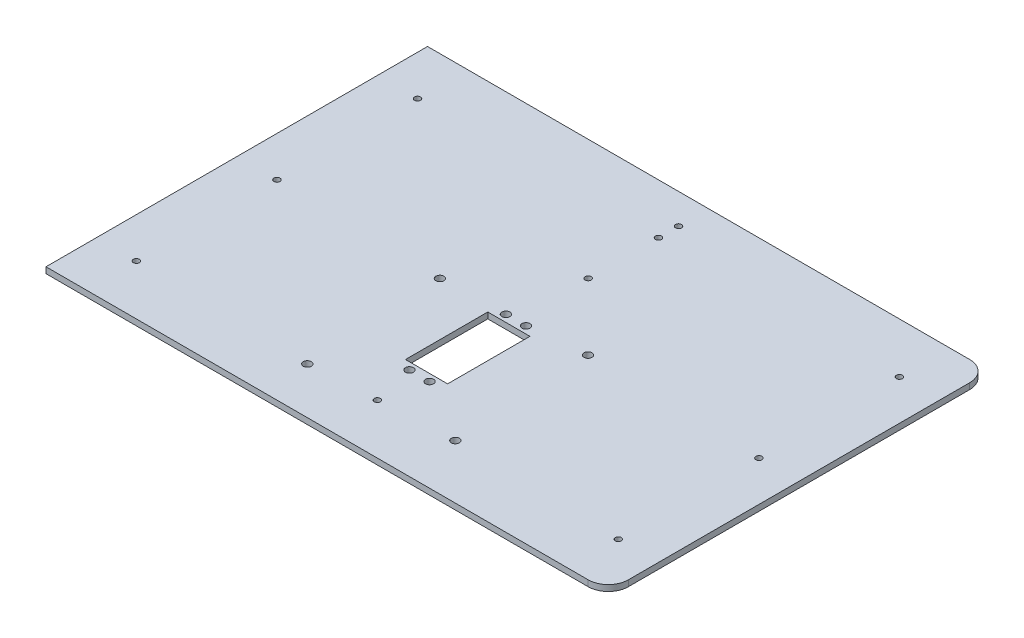
ISO-10303-21;
HEADER;
FILE_DESCRIPTION(('STEP AP214'),'2;1');
FILE_NAME('part.step','',(''),(''),'','','');
FILE_SCHEMA(('AUTOMOTIVE_DESIGN { 1 0 10303 214 1 1 1 1 }'));
ENDSEC;
DATA;
#1=APPLICATION_CONTEXT('core data for automotive mechanical design processes');
#2=APPLICATION_PROTOCOL_DEFINITION('international standard','automotive_design',2000,#1);
#3=PRODUCT_CONTEXT('',#1,'mechanical');
#4=PRODUCT('Part','Part','',(#3));
#5=PRODUCT_RELATED_PRODUCT_CATEGORY('part','',(#4));
#6=PRODUCT_DEFINITION_FORMATION('','',#4);
#7=PRODUCT_DEFINITION_CONTEXT('part definition',#1,'design');
#8=PRODUCT_DEFINITION('design','',#6,#7);
#9=PRODUCT_DEFINITION_SHAPE('','',#8);
#10=(LENGTH_UNIT() NAMED_UNIT(*) SI_UNIT(.MILLI.,.METRE.));
#11=(NAMED_UNIT(*) PLANE_ANGLE_UNIT() SI_UNIT($,.RADIAN.));
#12=(NAMED_UNIT(*) SI_UNIT($,.STERADIAN.) SOLID_ANGLE_UNIT());
#13=UNCERTAINTY_MEASURE_WITH_UNIT(LENGTH_MEASURE(1.E-05),#10,'distance_accuracy_value','');
#14=(GEOMETRIC_REPRESENTATION_CONTEXT(3) GLOBAL_UNCERTAINTY_ASSIGNED_CONTEXT((#13)) GLOBAL_UNIT_ASSIGNED_CONTEXT((#10,
#11,#12)) REPRESENTATION_CONTEXT('',''));
#15=CARTESIAN_POINT('',(0.,0.,0.));
#16=DIRECTION('',(0.,0.,1.));
#17=DIRECTION('',(1.,0.,0.));
#18=AXIS2_PLACEMENT_3D('',#15,#16,#17);
#19=CARTESIAN_POINT('',(0.,3.,0.));
#20=DIRECTION('',(0.,-1.,0.));
#21=DIRECTION('',(0.,0.,-1.));
#22=AXIS2_PLACEMENT_3D('',#19,#20,#21);
#23=PLANE('',#22);
#24=CARTESIAN_POINT('',(0.,3.,-35.));
#25=DIRECTION('',(0.,1.,0.));
#26=DIRECTION('',(0.,0.,1.));
#27=AXIS2_PLACEMENT_3D('',#24,#25,#26);
#28=CIRCLE('',#27,1.5);
#29=CARTESIAN_POINT('',(0.,3.,-33.5));
#30=VERTEX_POINT('',#29);
#31=EDGE_CURVE('E282',#30,#30,#28,.T.);
#32=ORIENTED_EDGE('',*,*,#31,.F.);
#33=EDGE_LOOP('',(#32));
#34=FACE_BOUND('',#33,.T.);
#35=CARTESIAN_POINT('',(0.,3.,-80.));
#36=DIRECTION('',(0.,1.,0.));
#37=DIRECTION('',(0.,0.,1.));
#38=AXIS2_PLACEMENT_3D('',#35,#36,#37);
#39=CIRCLE('',#38,1.5);
#40=CARTESIAN_POINT('',(0.,3.,-78.5));
#41=VERTEX_POINT('',#40);
#42=EDGE_CURVE('E272',#41,#41,#39,.T.);
#43=ORIENTED_EDGE('',*,*,#42,.F.);
#44=EDGE_LOOP('',(#43));
#45=FACE_BOUND('',#44,.T.);
#46=CARTESIAN_POINT('',(-120.,3.,0.));
#47=DIRECTION('',(0.,1.,0.));
#48=DIRECTION('',(0.,0.,1.));
#49=AXIS2_PLACEMENT_3D('',#46,#47,#48);
#50=CIRCLE('',#49,1.5);
#51=CARTESIAN_POINT('',(-120.,3.,1.5));
#52=VERTEX_POINT('',#51);
#53=EDGE_CURVE('E269',#52,#52,#50,.T.);
#54=ORIENTED_EDGE('',*,*,#53,.F.);
#55=EDGE_LOOP('',(#54));
#56=FACE_BOUND('',#55,.T.);
#57=CARTESIAN_POINT('',(120.,3.,0.));
#58=DIRECTION('',(0.,1.,0.));
#59=DIRECTION('',(0.,0.,1.));
#60=AXIS2_PLACEMENT_3D('',#57,#58,#59);
#61=CIRCLE('',#60,1.5);
#62=CARTESIAN_POINT('',(120.,3.,1.5));
#63=VERTEX_POINT('',#62);
#64=EDGE_CURVE('E266',#63,#63,#61,.T.);
#65=ORIENTED_EDGE('',*,*,#64,.F.);
#66=EDGE_LOOP('',(#65));
#67=FACE_BOUND('',#66,.T.);
#68=CARTESIAN_POINT('',(0.,3.,-70.));
#69=DIRECTION('',(0.,-1.,0.));
#70=DIRECTION('',(0.,0.,-1.));
#71=AXIS2_PLACEMENT_3D('',#68,#69,#70);
#72=CIRCLE('',#71,1.5);
#73=CARTESIAN_POINT('',(0.,3.,-71.5));
#74=VERTEX_POINT('',#73);
#75=EDGE_CURVE('E259',#74,#74,#72,.T.);
#76=ORIENTED_EDGE('',*,*,#75,.T.);
#77=EDGE_LOOP('',(#76));
#78=FACE_BOUND('',#77,.T.);
#79=CARTESIAN_POINT('',(-120.,3.,-70.));
#80=DIRECTION('',(0.,-1.,0.));
#81=DIRECTION('',(0.,0.,-1.));
#82=AXIS2_PLACEMENT_3D('',#79,#80,#81);
#83=CIRCLE('',#82,1.5);
#84=CARTESIAN_POINT('',(-120.,3.,-71.5));
#85=VERTEX_POINT('',#84);
#86=EDGE_CURVE('E265',#85,#85,#83,.T.);
#87=ORIENTED_EDGE('',*,*,#86,.T.);
#88=EDGE_LOOP('',(#87));
#89=FACE_BOUND('',#88,.T.);
#90=CARTESIAN_POINT('',(120.,3.,-70.));
#91=DIRECTION('',(0.,-1.,0.));
#92=DIRECTION('',(0.,0.,-1.));
#93=AXIS2_PLACEMENT_3D('',#90,#91,#92);
#94=CIRCLE('',#93,1.5);
#95=CARTESIAN_POINT('',(120.,3.,-71.5));
#96=VERTEX_POINT('',#95);
#97=EDGE_CURVE('E254',#96,#96,#94,.T.);
#98=ORIENTED_EDGE('',*,*,#97,.T.);
#99=EDGE_LOOP('',(#98));
#100=FACE_BOUND('',#99,.T.);
#101=CARTESIAN_POINT('',(0.,3.,70.));
#102=DIRECTION('',(0.,1.,0.));
#103=DIRECTION('',(0.,0.,1.));
#104=AXIS2_PLACEMENT_3D('',#101,#102,#103);
#105=CIRCLE('',#104,1.5);
#106=CARTESIAN_POINT('',(0.,3.,71.5));
#107=VERTEX_POINT('',#106);
#108=EDGE_CURVE('E247',#107,#107,#105,.T.);
#109=ORIENTED_EDGE('',*,*,#108,.F.);
#110=EDGE_LOOP('',(#109));
#111=FACE_BOUND('',#110,.T.);
#112=CARTESIAN_POINT('',(-120.,3.,70.));
#113=DIRECTION('',(0.,1.,0.));
#114=DIRECTION('',(0.,0.,1.));
#115=AXIS2_PLACEMENT_3D('',#112,#113,#114);
#116=CIRCLE('',#115,1.5);
#117=CARTESIAN_POINT('',(-120.,3.,71.5));
#118=VERTEX_POINT('',#117);
#119=EDGE_CURVE('E253',#118,#118,#116,.T.);
#120=ORIENTED_EDGE('',*,*,#119,.F.);
#121=EDGE_LOOP('',(#120));
#122=FACE_BOUND('',#121,.T.);
#123=CARTESIAN_POINT('',(120.,3.,70.));
#124=DIRECTION('',(0.,1.,0.));
#125=DIRECTION('',(0.,0.,1.));
#126=AXIS2_PLACEMENT_3D('',#123,#124,#125);
#127=CIRCLE('',#126,1.5);
#128=CARTESIAN_POINT('',(120.,3.,71.5));
#129=VERTEX_POINT('',#128);
#130=EDGE_CURVE('E242',#129,#129,#127,.T.);
#131=ORIENTED_EDGE('',*,*,#130,.F.);
#132=EDGE_LOOP('',(#131));
#133=FACE_BOUND('',#132,.T.);
#134=CARTESIAN_POINT('',(33.0281343560983,3.,-1.86993817402548));
#135=DIRECTION('',(0.,1.,0.));
#136=DIRECTION('',(0.,0.,1.));
#137=AXIS2_PLACEMENT_3D('',#134,#135,#136);
#138=CIRCLE('',#137,2.);
#139=CARTESIAN_POINT('',(33.0281343560983,3.,0.130061825974525));
#140=VERTEX_POINT('',#139);
#141=EDGE_CURVE('E162',#140,#140,#138,.T.);
#142=ORIENTED_EDGE('',*,*,#141,.F.);
#143=EDGE_LOOP('',(#142));
#144=FACE_BOUND('',#143,.T.);
#145=CARTESIAN_POINT('',(-36.8699381740117,3.,1.97186564390339));
#146=DIRECTION('',(0.,1.,0.));
#147=DIRECTION('',(0.,0.,1.));
#148=AXIS2_PLACEMENT_3D('',#145,#146,#147);
#149=CIRCLE('',#148,2.);
#150=CARTESIAN_POINT('',(-36.8699381740117,3.,3.97186564390339));
#151=VERTEX_POINT('',#150);
#152=EDGE_CURVE('E168',#151,#151,#149,.T.);
#153=ORIENTED_EDGE('',*,*,#152,.F.);
#154=EDGE_LOOP('',(#153));
#155=FACE_BOUND('',#154,.T.);
#156=CARTESIAN_POINT('',(-33.028134356083,3.,71.8699381740136));
#157=DIRECTION('',(0.,1.,0.));
#158=DIRECTION('',(0.,0.,1.));
#159=AXIS2_PLACEMENT_3D('',#156,#157,#158);
#160=CIRCLE('',#159,2.);
#161=CARTESIAN_POINT('',(-33.028134356083,3.,73.8699381740136));
#162=VERTEX_POINT('',#161);
#163=EDGE_CURVE('E174',#162,#162,#160,.T.);
#164=ORIENTED_EDGE('',*,*,#163,.F.);
#165=EDGE_LOOP('',(#164));
#166=FACE_BOUND('',#165,.T.);
#167=CARTESIAN_POINT('',(5.,3.,49.));
#168=DIRECTION('',(0.,1.,0.));
#169=DIRECTION('',(0.,0.,1.));
#170=AXIS2_PLACEMENT_3D('',#167,#168,#169);
#171=CIRCLE('',#170,2.);
#172=CARTESIAN_POINT('',(5.,3.,51.));
#173=VERTEX_POINT('',#172);
#174=EDGE_CURVE('E180',#173,#173,#171,.T.);
#175=ORIENTED_EDGE('',*,*,#174,.F.);
#176=EDGE_LOOP('',(#175));
#177=FACE_BOUND('',#176,.T.);
#178=CARTESIAN_POINT('',(-5.,3.,49.));
#179=DIRECTION('',(0.,1.,0.));
#180=DIRECTION('',(0.,0.,1.));
#181=AXIS2_PLACEMENT_3D('',#178,#179,#180);
#182=CIRCLE('',#181,2.);
#183=CARTESIAN_POINT('',(-5.,3.,51.));
#184=VERTEX_POINT('',#183);
#185=EDGE_CURVE('E186',#184,#184,#182,.T.);
#186=ORIENTED_EDGE('',*,*,#185,.F.);
#187=EDGE_LOOP('',(#186));
#188=FACE_BOUND('',#187,.T.);
#189=CARTESIAN_POINT('',(-5.,3.,1.));
#190=DIRECTION('',(0.,1.,0.));
#191=DIRECTION('',(0.,0.,1.));
#192=AXIS2_PLACEMENT_3D('',#189,#190,#191);
#193=CIRCLE('',#192,2.);
#194=CARTESIAN_POINT('',(-5.,3.,3.));
#195=VERTEX_POINT('',#194);
#196=EDGE_CURVE('E192',#195,#195,#193,.T.);
#197=ORIENTED_EDGE('',*,*,#196,.F.);
#198=EDGE_LOOP('',(#197));
#199=FACE_BOUND('',#198,.T.);
#200=CARTESIAN_POINT('',(5.,3.,1.));
#201=DIRECTION('',(0.,1.,0.));
#202=DIRECTION('',(0.,0.,1.));
#203=AXIS2_PLACEMENT_3D('',#200,#201,#202);
#204=CIRCLE('',#203,2.);
#205=CARTESIAN_POINT('',(5.,3.,3.));
#206=VERTEX_POINT('',#205);
#207=EDGE_CURVE('E198',#206,#206,#204,.T.);
#208=ORIENTED_EDGE('',*,*,#207,.F.);
#209=EDGE_LOOP('',(#208));
#210=FACE_BOUND('',#209,.T.);
#211=DIRECTION('',(1.,0.,0.));
#212=VECTOR('',#211,1.);
#213=CARTESIAN_POINT('',(140.,3.,95.));
#214=LINE('',#213,#212);
#215=CARTESIAN_POINT('',(-140.,3.,95.));
#216=VERTEX_POINT('',#215);
#217=CARTESIAN_POINT('',(130.,3.,95.));
#218=VERTEX_POINT('',#217);
#219=EDGE_CURVE('E211',#216,#218,#214,.T.);
#220=ORIENTED_EDGE('',*,*,#219,.T.);
#221=CARTESIAN_POINT('',(130.,3.,85.));
#222=DIRECTION('',(0.,-1.,0.));
#223=DIRECTION('',(0.,0.,-1.));
#224=AXIS2_PLACEMENT_3D('',#221,#222,#223);
#225=CIRCLE('',#224,10.);
#226=CARTESIAN_POINT('',(140.,3.,84.9999999999999));
#227=VERTEX_POINT('',#226);
#228=EDGE_CURVE('E44',#218,#227,#225,.F.);
#229=ORIENTED_EDGE('',*,*,#228,.T.);
#230=DIRECTION('',(0.,0.,-1.));
#231=VECTOR('',#230,1.);
#232=CARTESIAN_POINT('',(140.,3.,-95.));
#233=LINE('',#232,#231);
#234=CARTESIAN_POINT('',(140.,3.,-85.));
#235=VERTEX_POINT('',#234);
#236=EDGE_CURVE('E204',#227,#235,#233,.T.);
#237=ORIENTED_EDGE('',*,*,#236,.T.);
#238=CARTESIAN_POINT('',(130.,3.,-85.));
#239=DIRECTION('',(0.,-1.,0.));
#240=DIRECTION('',(0.,0.,-1.));
#241=AXIS2_PLACEMENT_3D('',#238,#239,#240);
#242=CIRCLE('',#241,10.);
#243=CARTESIAN_POINT('',(130.,3.,-95.));
#244=VERTEX_POINT('',#243);
#245=EDGE_CURVE('E52',#235,#244,#242,.F.);
#246=ORIENTED_EDGE('',*,*,#245,.T.);
#247=DIRECTION('',(-1.,0.,0.));
#248=VECTOR('',#247,1.);
#249=CARTESIAN_POINT('',(140.,3.,-95.));
#250=LINE('',#249,#248);
#251=CARTESIAN_POINT('',(-140.,3.,-95.));
#252=VERTEX_POINT('',#251);
#253=EDGE_CURVE('E206',#244,#252,#250,.T.);
#254=ORIENTED_EDGE('',*,*,#253,.T.);
#255=DIRECTION('',(0.,0.,1.));
#256=VECTOR('',#255,1.);
#257=CARTESIAN_POINT('',(-140.,3.,-95.));
#258=LINE('',#257,#256);
#259=EDGE_CURVE('E209',#252,#216,#258,.T.);
#260=ORIENTED_EDGE('',*,*,#259,.T.);
#261=EDGE_LOOP('',(#220,#229,#237,#246,#254,#260));
#262=FACE_BOUND('',#261,.T.);
#263=DIRECTION('',(0.,0.,-1.));
#264=VECTOR('',#263,1.);
#265=CARTESIAN_POINT('',(10.5,3.,45.5));
#266=LINE('',#265,#264);
#267=CARTESIAN_POINT('',(10.5,3.,45.5));
#268=VERTEX_POINT('',#267);
#269=CARTESIAN_POINT('',(10.5,3.,4.5));
#270=VERTEX_POINT('',#269);
#271=EDGE_CURVE('E118',#268,#270,#266,.T.);
#272=ORIENTED_EDGE('',*,*,#271,.F.);
#273=DIRECTION('',(1.,0.,0.));
#274=VECTOR('',#273,1.);
#275=CARTESIAN_POINT('',(10.5,3.,45.5));
#276=LINE('',#275,#274);
#277=CARTESIAN_POINT('',(-10.5,3.,45.5));
#278=VERTEX_POINT('',#277);
#279=EDGE_CURVE('E144',#278,#268,#276,.T.);
#280=ORIENTED_EDGE('',*,*,#279,.F.);
#281=DIRECTION('',(0.,0.,1.));
#282=VECTOR('',#281,1.);
#283=CARTESIAN_POINT('',(-10.5,3.,45.5));
#284=LINE('',#283,#282);
#285=CARTESIAN_POINT('',(-10.5,3.,4.5));
#286=VERTEX_POINT('',#285);
#287=EDGE_CURVE('E142',#286,#278,#284,.T.);
#288=ORIENTED_EDGE('',*,*,#287,.F.);
#289=DIRECTION('',(-1.,0.,0.));
#290=VECTOR('',#289,1.);
#291=CARTESIAN_POINT('',(10.5,3.,4.5));
#292=LINE('',#291,#290);
#293=EDGE_CURVE('E128',#270,#286,#292,.T.);
#294=ORIENTED_EDGE('',*,*,#293,.F.);
#295=EDGE_LOOP('',(#272,#280,#288,#294));
#296=FACE_BOUND('',#295,.T.);
#297=CARTESIAN_POINT('',(36.8699381740273,3.,68.0281343560848));
#298=DIRECTION('',(0.,1.,0.));
#299=DIRECTION('',(0.,0.,1.));
#300=AXIS2_PLACEMENT_3D('',#297,#298,#299);
#301=CIRCLE('',#300,2.);
#302=CARTESIAN_POINT('',(36.8699381740273,3.,70.0281343560848));
#303=VERTEX_POINT('',#302);
#304=EDGE_CURVE('E151',#303,#303,#301,.T.);
#305=ORIENTED_EDGE('',*,*,#304,.F.);
#306=EDGE_LOOP('',(#305));
#307=FACE_BOUND('',#306,.T.);
#308=ADVANCED_FACE('F35',(#34,#45,#56,#67,#78,#89,#100,#111,#122,#133,#144,#155,#166,#177,#188,
#199,#210,#262,#296,#307),#23,.F.);
#309=CARTESIAN_POINT('',(0.,0.,0.));
#310=DIRECTION('',(0.,-1.,0.));
#311=DIRECTION('',(0.,0.,-1.));
#312=AXIS2_PLACEMENT_3D('',#309,#310,#311);
#313=PLANE('',#312);
#314=CARTESIAN_POINT('',(0.,0.,-35.));
#315=DIRECTION('',(0.,-1.,0.));
#316=DIRECTION('',(0.,0.,-1.));
#317=AXIS2_PLACEMENT_3D('',#314,#315,#316);
#318=CIRCLE('',#317,1.5);
#319=CARTESIAN_POINT('',(0.,0.,-36.5));
#320=VERTEX_POINT('',#319);
#321=EDGE_CURVE('E39',#320,#320,#318,.T.);
#322=ORIENTED_EDGE('',*,*,#321,.F.);
#323=EDGE_LOOP('',(#322));
#324=FACE_BOUND('',#323,.T.);
#325=CARTESIAN_POINT('',(0.,0.,-80.));
#326=DIRECTION('',(0.,-1.,0.));
#327=DIRECTION('',(0.,0.,-1.));
#328=AXIS2_PLACEMENT_3D('',#325,#326,#327);
#329=CIRCLE('',#328,1.5);
#330=CARTESIAN_POINT('',(0.,0.,-81.5));
#331=VERTEX_POINT('',#330);
#332=EDGE_CURVE('E270',#331,#331,#329,.T.);
#333=ORIENTED_EDGE('',*,*,#332,.F.);
#334=EDGE_LOOP('',(#333));
#335=FACE_BOUND('',#334,.T.);
#336=CARTESIAN_POINT('',(-120.,0.,0.));
#337=DIRECTION('',(0.,-1.,0.));
#338=DIRECTION('',(0.,0.,-1.));
#339=AXIS2_PLACEMENT_3D('',#336,#337,#338);
#340=CIRCLE('',#339,1.5);
#341=CARTESIAN_POINT('',(-120.,0.,-1.5));
#342=VERTEX_POINT('',#341);
#343=EDGE_CURVE('E267',#342,#342,#340,.T.);
#344=ORIENTED_EDGE('',*,*,#343,.F.);
#345=EDGE_LOOP('',(#344));
#346=FACE_BOUND('',#345,.T.);
#347=CARTESIAN_POINT('',(120.,0.,0.));
#348=DIRECTION('',(0.,-1.,0.));
#349=DIRECTION('',(0.,0.,-1.));
#350=AXIS2_PLACEMENT_3D('',#347,#348,#349);
#351=CIRCLE('',#350,1.5);
#352=CARTESIAN_POINT('',(120.,0.,-1.5));
#353=VERTEX_POINT('',#352);
#354=EDGE_CURVE('E262',#353,#353,#351,.T.);
#355=ORIENTED_EDGE('',*,*,#354,.F.);
#356=EDGE_LOOP('',(#355));
#357=FACE_BOUND('',#356,.T.);
#358=CARTESIAN_POINT('',(0.,0.,-70.));
#359=DIRECTION('',(0.,-1.,0.));
#360=DIRECTION('',(0.,0.,-1.));
#361=AXIS2_PLACEMENT_3D('',#358,#359,#360);
#362=CIRCLE('',#361,1.5);
#363=CARTESIAN_POINT('',(0.,0.,-71.5));
#364=VERTEX_POINT('',#363);
#365=EDGE_CURVE('E258',#364,#364,#362,.F.);
#366=ORIENTED_EDGE('',*,*,#365,.T.);
#367=EDGE_LOOP('',(#366));
#368=FACE_BOUND('',#367,.T.);
#369=CARTESIAN_POINT('',(-120.,0.,-70.));
#370=DIRECTION('',(0.,-1.,0.));
#371=DIRECTION('',(0.,0.,-1.));
#372=AXIS2_PLACEMENT_3D('',#369,#370,#371);
#373=CIRCLE('',#372,1.5);
#374=CARTESIAN_POINT('',(-120.,0.,-71.5));
#375=VERTEX_POINT('',#374);
#376=EDGE_CURVE('E255',#375,#375,#373,.F.);
#377=ORIENTED_EDGE('',*,*,#376,.T.);
#378=EDGE_LOOP('',(#377));
#379=FACE_BOUND('',#378,.T.);
#380=CARTESIAN_POINT('',(120.,0.,-70.));
#381=DIRECTION('',(0.,-1.,0.));
#382=DIRECTION('',(0.,0.,-1.));
#383=AXIS2_PLACEMENT_3D('',#380,#381,#382);
#384=CIRCLE('',#383,1.5);
#385=CARTESIAN_POINT('',(120.,0.,-71.5));
#386=VERTEX_POINT('',#385);
#387=EDGE_CURVE('E250',#386,#386,#384,.F.);
#388=ORIENTED_EDGE('',*,*,#387,.T.);
#389=EDGE_LOOP('',(#388));
#390=FACE_BOUND('',#389,.T.);
#391=CARTESIAN_POINT('',(0.,0.,70.));
#392=DIRECTION('',(0.,-1.,0.));
#393=DIRECTION('',(0.,0.,-1.));
#394=AXIS2_PLACEMENT_3D('',#391,#392,#393);
#395=CIRCLE('',#394,1.5);
#396=CARTESIAN_POINT('',(0.,0.,68.5));
#397=VERTEX_POINT('',#396);
#398=EDGE_CURVE('E246',#397,#397,#395,.T.);
#399=ORIENTED_EDGE('',*,*,#398,.F.);
#400=EDGE_LOOP('',(#399));
#401=FACE_BOUND('',#400,.T.);
#402=CARTESIAN_POINT('',(-120.,0.,70.));
#403=DIRECTION('',(0.,-1.,0.));
#404=DIRECTION('',(0.,0.,-1.));
#405=AXIS2_PLACEMENT_3D('',#402,#403,#404);
#406=CIRCLE('',#405,1.5);
#407=CARTESIAN_POINT('',(-120.,0.,68.5));
#408=VERTEX_POINT('',#407);
#409=EDGE_CURVE('E243',#408,#408,#406,.T.);
#410=ORIENTED_EDGE('',*,*,#409,.F.);
#411=EDGE_LOOP('',(#410));
#412=FACE_BOUND('',#411,.T.);
#413=CARTESIAN_POINT('',(120.,0.,70.));
#414=DIRECTION('',(0.,-1.,0.));
#415=DIRECTION('',(0.,0.,-1.));
#416=AXIS2_PLACEMENT_3D('',#413,#414,#415);
#417=CIRCLE('',#416,1.5);
#418=CARTESIAN_POINT('',(120.,0.,68.5));
#419=VERTEX_POINT('',#418);
#420=EDGE_CURVE('E238',#419,#419,#417,.T.);
#421=ORIENTED_EDGE('',*,*,#420,.F.);
#422=EDGE_LOOP('',(#421));
#423=FACE_BOUND('',#422,.T.);
#424=DIRECTION('',(1.,0.,0.));
#425=VECTOR('',#424,1.);
#426=CARTESIAN_POINT('',(10.5,0.,45.5));
#427=LINE('',#426,#425);
#428=CARTESIAN_POINT('',(-10.5,0.,45.5));
#429=VERTEX_POINT('',#428);
#430=CARTESIAN_POINT('',(10.5,0.,45.5));
#431=VERTEX_POINT('',#430);
#432=EDGE_CURVE('E129',#429,#431,#427,.T.);
#433=ORIENTED_EDGE('',*,*,#432,.T.);
#434=DIRECTION('',(0.,0.,-1.));
#435=VECTOR('',#434,1.);
#436=CARTESIAN_POINT('',(10.5,0.,45.5));
#437=LINE('',#436,#435);
#438=CARTESIAN_POINT('',(10.5,0.,4.5));
#439=VERTEX_POINT('',#438);
#440=EDGE_CURVE('E149',#431,#439,#437,.T.);
#441=ORIENTED_EDGE('',*,*,#440,.T.);
#442=DIRECTION('',(-1.,0.,0.));
#443=VECTOR('',#442,1.);
#444=CARTESIAN_POINT('',(10.5,0.,4.5));
#445=LINE('',#444,#443);
#446=CARTESIAN_POINT('',(-10.5,0.,4.5));
#447=VERTEX_POINT('',#446);
#448=EDGE_CURVE('E135',#439,#447,#445,.T.);
#449=ORIENTED_EDGE('',*,*,#448,.T.);
#450=DIRECTION('',(0.,0.,1.));
#451=VECTOR('',#450,1.);
#452=CARTESIAN_POINT('',(-10.5,0.,45.5));
#453=LINE('',#452,#451);
#454=EDGE_CURVE('E153',#447,#429,#453,.T.);
#455=ORIENTED_EDGE('',*,*,#454,.T.);
#456=EDGE_LOOP('',(#433,#441,#449,#455));
#457=FACE_BOUND('',#456,.T.);
#458=CARTESIAN_POINT('',(33.0281343560983,0.,-1.86993817402548));
#459=DIRECTION('',(0.,1.,0.));
#460=DIRECTION('',(0.,0.,1.));
#461=AXIS2_PLACEMENT_3D('',#458,#459,#460);
#462=CIRCLE('',#461,2.);
#463=CARTESIAN_POINT('',(33.0281343560983,0.,0.130061825974525));
#464=VERTEX_POINT('',#463);
#465=EDGE_CURVE('E136',#464,#464,#462,.T.);
#466=ORIENTED_EDGE('',*,*,#465,.T.);
#467=EDGE_LOOP('',(#466));
#468=FACE_BOUND('',#467,.T.);
#469=CARTESIAN_POINT('',(-33.028134356083,0.,71.8699381740136));
#470=DIRECTION('',(0.,1.,0.));
#471=DIRECTION('',(0.,0.,1.));
#472=AXIS2_PLACEMENT_3D('',#469,#470,#471);
#473=CIRCLE('',#472,2.);
#474=CARTESIAN_POINT('',(-33.028134356083,0.,73.8699381740136));
#475=VERTEX_POINT('',#474);
#476=EDGE_CURVE('E171',#475,#475,#473,.T.);
#477=ORIENTED_EDGE('',*,*,#476,.T.);
#478=EDGE_LOOP('',(#477));
#479=FACE_BOUND('',#478,.T.);
#480=CARTESIAN_POINT('',(-5.,0.,49.));
#481=DIRECTION('',(0.,1.,0.));
#482=DIRECTION('',(0.,0.,1.));
#483=AXIS2_PLACEMENT_3D('',#480,#481,#482);
#484=CIRCLE('',#483,2.);
#485=CARTESIAN_POINT('',(-5.,0.,51.));
#486=VERTEX_POINT('',#485);
#487=EDGE_CURVE('E183',#486,#486,#484,.T.);
#488=ORIENTED_EDGE('',*,*,#487,.T.);
#489=EDGE_LOOP('',(#488));
#490=FACE_BOUND('',#489,.T.);
#491=CARTESIAN_POINT('',(5.,0.,1.));
#492=DIRECTION('',(0.,1.,0.));
#493=DIRECTION('',(0.,0.,1.));
#494=AXIS2_PLACEMENT_3D('',#491,#492,#493);
#495=CIRCLE('',#494,2.);
#496=CARTESIAN_POINT('',(5.,0.,3.));
#497=VERTEX_POINT('',#496);
#498=EDGE_CURVE('E195',#497,#497,#495,.T.);
#499=ORIENTED_EDGE('',*,*,#498,.T.);
#500=EDGE_LOOP('',(#499));
#501=FACE_BOUND('',#500,.T.);
#502=DIRECTION('',(0.,0.,-1.));
#503=VECTOR('',#502,1.);
#504=CARTESIAN_POINT('',(140.,0.,-95.));
#505=LINE('',#504,#503);
#506=CARTESIAN_POINT('',(140.,0.,84.9999999999999));
#507=VERTEX_POINT('',#506);
#508=CARTESIAN_POINT('',(140.,0.,-85.));
#509=VERTEX_POINT('',#508);
#510=EDGE_CURVE('E201',#507,#509,#505,.T.);
#511=ORIENTED_EDGE('',*,*,#510,.F.);
#512=CARTESIAN_POINT('',(130.,0.,85.));
#513=DIRECTION('',(0.,-1.,0.));
#514=DIRECTION('',(0.,0.,-1.));
#515=AXIS2_PLACEMENT_3D('',#512,#513,#514);
#516=CIRCLE('',#515,10.);
#517=CARTESIAN_POINT('',(130.,0.,95.));
#518=VERTEX_POINT('',#517);
#519=EDGE_CURVE('E233',#507,#518,#516,.T.);
#520=ORIENTED_EDGE('',*,*,#519,.T.);
#521=DIRECTION('',(1.,0.,0.));
#522=VECTOR('',#521,1.);
#523=CARTESIAN_POINT('',(140.,0.,95.));
#524=LINE('',#523,#522);
#525=CARTESIAN_POINT('',(-140.,0.,95.));
#526=VERTEX_POINT('',#525);
#527=EDGE_CURVE('E207',#526,#518,#524,.T.);
#528=ORIENTED_EDGE('',*,*,#527,.F.);
#529=DIRECTION('',(0.,0.,1.));
#530=VECTOR('',#529,1.);
#531=CARTESIAN_POINT('',(-140.,0.,-95.));
#532=LINE('',#531,#530);
#533=CARTESIAN_POINT('',(-140.,0.,-95.));
#534=VERTEX_POINT('',#533);
#535=EDGE_CURVE('E218',#534,#526,#532,.T.);
#536=ORIENTED_EDGE('',*,*,#535,.F.);
#537=DIRECTION('',(-1.,0.,0.));
#538=VECTOR('',#537,1.);
#539=CARTESIAN_POINT('',(140.,0.,-95.));
#540=LINE('',#539,#538);
#541=CARTESIAN_POINT('',(130.,0.,-95.));
#542=VERTEX_POINT('',#541);
#543=EDGE_CURVE('E216',#542,#534,#540,.T.);
#544=ORIENTED_EDGE('',*,*,#543,.F.);
#545=CARTESIAN_POINT('',(130.,0.,-85.));
#546=DIRECTION('',(0.,-1.,0.));
#547=DIRECTION('',(0.,0.,-1.));
#548=AXIS2_PLACEMENT_3D('',#545,#546,#547);
#549=CIRCLE('',#548,10.);
#550=EDGE_CURVE('E231',#542,#509,#549,.T.);
#551=ORIENTED_EDGE('',*,*,#550,.T.);
#552=EDGE_LOOP('',(#511,#520,#528,#536,#544,#551));
#553=FACE_BOUND('',#552,.T.);
#554=CARTESIAN_POINT('',(-5.,0.,1.));
#555=DIRECTION('',(0.,1.,0.));
#556=DIRECTION('',(0.,0.,1.));
#557=AXIS2_PLACEMENT_3D('',#554,#555,#556);
#558=CIRCLE('',#557,2.);
#559=CARTESIAN_POINT('',(-5.,0.,3.));
#560=VERTEX_POINT('',#559);
#561=EDGE_CURVE('E189',#560,#560,#558,.T.);
#562=ORIENTED_EDGE('',*,*,#561,.T.);
#563=EDGE_LOOP('',(#562));
#564=FACE_BOUND('',#563,.T.);
#565=CARTESIAN_POINT('',(5.,0.,49.));
#566=DIRECTION('',(0.,1.,0.));
#567=DIRECTION('',(0.,0.,1.));
#568=AXIS2_PLACEMENT_3D('',#565,#566,#567);
#569=CIRCLE('',#568,2.);
#570=CARTESIAN_POINT('',(5.,0.,51.));
#571=VERTEX_POINT('',#570);
#572=EDGE_CURVE('E177',#571,#571,#569,.T.);
#573=ORIENTED_EDGE('',*,*,#572,.T.);
#574=EDGE_LOOP('',(#573));
#575=FACE_BOUND('',#574,.T.);
#576=CARTESIAN_POINT('',(-36.8699381740117,0.,1.97186564390339));
#577=DIRECTION('',(0.,1.,0.));
#578=DIRECTION('',(0.,0.,1.));
#579=AXIS2_PLACEMENT_3D('',#576,#577,#578);
#580=CIRCLE('',#579,2.);
#581=CARTESIAN_POINT('',(-36.8699381740117,0.,3.97186564390339));
#582=VERTEX_POINT('',#581);
#583=EDGE_CURVE('E165',#582,#582,#580,.T.);
#584=ORIENTED_EDGE('',*,*,#583,.T.);
#585=EDGE_LOOP('',(#584));
#586=FACE_BOUND('',#585,.T.);
#587=CARTESIAN_POINT('',(36.8699381740273,0.,68.0281343560848));
#588=DIRECTION('',(0.,1.,0.));
#589=DIRECTION('',(0.,0.,1.));
#590=AXIS2_PLACEMENT_3D('',#587,#588,#589);
#591=CIRCLE('',#590,2.);
#592=CARTESIAN_POINT('',(36.8699381740273,0.,70.0281343560848));
#593=VERTEX_POINT('',#592);
#594=EDGE_CURVE('E241',#593,#593,#591,.T.);
#595=ORIENTED_EDGE('',*,*,#594,.T.);
#596=EDGE_LOOP('',(#595));
#597=FACE_BOUND('',#596,.T.);
#598=ADVANCED_FACE('F303',(#324,#335,#346,#357,#368,#379,#390,#401,#412,#423,#457,#468,#479,
#490,#501,#553,#564,#575,#586,#597),#313,.T.);
#599=CARTESIAN_POINT('',(140.,3.,-95.));
#600=DIRECTION('',(-1.,0.,0.));
#601=DIRECTION('',(0.,0.,1.));
#602=AXIS2_PLACEMENT_3D('',#599,#600,#601);
#603=PLANE('',#602);
#604=ORIENTED_EDGE('',*,*,#236,.F.);
#605=DIRECTION('',(0.,-1.,0.));
#606=VECTOR('',#605,1.);
#607=CARTESIAN_POINT('',(140.,3.,85.));
#608=LINE('',#607,#606);
#609=EDGE_CURVE('E228',#227,#507,#608,.T.);
#610=ORIENTED_EDGE('',*,*,#609,.T.);
#611=ORIENTED_EDGE('',*,*,#510,.T.);
#612=DIRECTION('',(0.,-1.,0.));
#613=VECTOR('',#612,1.);
#614=CARTESIAN_POINT('',(140.,3.,-85.));
#615=LINE('',#614,#613);
#616=EDGE_CURVE('E226',#509,#235,#615,.F.);
#617=ORIENTED_EDGE('',*,*,#616,.T.);
#618=EDGE_LOOP('',(#604,#610,#611,#617));
#619=FACE_BOUND('',#618,.T.);
#620=ADVANCED_FACE('F326',(#619),#603,.F.);
#621=CARTESIAN_POINT('',(140.,3.,-95.));
#622=DIRECTION('',(0.,0.,1.));
#623=DIRECTION('',(1.,0.,0.));
#624=AXIS2_PLACEMENT_3D('',#621,#622,#623);
#625=PLANE('',#624);
#626=ORIENTED_EDGE('',*,*,#253,.F.);
#627=DIRECTION('',(0.,-1.,0.));
#628=VECTOR('',#627,1.);
#629=CARTESIAN_POINT('',(130.,3.,-95.));
#630=LINE('',#629,#628);
#631=EDGE_CURVE('E11',#244,#542,#630,.T.);
#632=ORIENTED_EDGE('',*,*,#631,.T.);
#633=ORIENTED_EDGE('',*,*,#543,.T.);
#634=DIRECTION('',(0.,-1.,0.));
#635=VECTOR('',#634,1.);
#636=CARTESIAN_POINT('',(-140.,3.,-95.));
#637=LINE('',#636,#635);
#638=EDGE_CURVE('E223',#252,#534,#637,.T.);
#639=ORIENTED_EDGE('',*,*,#638,.F.);
#640=EDGE_LOOP('',(#626,#632,#633,#639));
#641=FACE_BOUND('',#640,.T.);
#642=ADVANCED_FACE('F341',(#641),#625,.F.);
#643=CARTESIAN_POINT('',(-140.,3.,-95.));
#644=DIRECTION('',(1.,0.,0.));
#645=DIRECTION('',(0.,0.,-1.));
#646=AXIS2_PLACEMENT_3D('',#643,#644,#645);
#647=PLANE('',#646);
#648=ORIENTED_EDGE('',*,*,#535,.T.);
#649=DIRECTION('',(0.,-1.,0.));
#650=VECTOR('',#649,1.);
#651=CARTESIAN_POINT('',(-140.,3.,95.));
#652=LINE('',#651,#650);
#653=EDGE_CURVE('E213',#216,#526,#652,.T.);
#654=ORIENTED_EDGE('',*,*,#653,.F.);
#655=ORIENTED_EDGE('',*,*,#259,.F.);
#656=ORIENTED_EDGE('',*,*,#638,.T.);
#657=EDGE_LOOP('',(#648,#654,#655,#656));
#658=FACE_BOUND('',#657,.T.);
#659=ADVANCED_FACE('F338',(#658),#647,.F.);
#660=CARTESIAN_POINT('',(140.,3.,95.));
#661=DIRECTION('',(0.,0.,-1.));
#662=DIRECTION('',(-1.,0.,0.));
#663=AXIS2_PLACEMENT_3D('',#660,#661,#662);
#664=PLANE('',#663);
#665=ORIENTED_EDGE('',*,*,#527,.T.);
#666=DIRECTION('',(0.,-1.,0.));
#667=VECTOR('',#666,1.);
#668=CARTESIAN_POINT('',(130.,3.,95.));
#669=LINE('',#668,#667);
#670=EDGE_CURVE('E60',#518,#218,#669,.F.);
#671=ORIENTED_EDGE('',*,*,#670,.T.);
#672=ORIENTED_EDGE('',*,*,#219,.F.);
#673=ORIENTED_EDGE('',*,*,#653,.T.);
#674=EDGE_LOOP('',(#665,#671,#672,#673));
#675=FACE_BOUND('',#674,.T.);
#676=ADVANCED_FACE('F335',(#675),#664,.F.);
#677=CARTESIAN_POINT('',(5.,3.,1.));
#678=DIRECTION('',(0.,-1.,0.));
#679=DIRECTION('',(0.,0.,-1.));
#680=AXIS2_PLACEMENT_3D('',#677,#678,#679);
#681=CYLINDRICAL_SURFACE('',#680,2.);
#682=ORIENTED_EDGE('',*,*,#207,.T.);
#683=EDGE_LOOP('',(#682));
#684=FACE_BOUND('',#683,.T.);
#685=ORIENTED_EDGE('',*,*,#498,.F.);
#686=EDGE_LOOP('',(#685));
#687=FACE_BOUND('',#686,.T.);
#688=ADVANCED_FACE('F332',(#684,#687),#681,.F.);
#689=CARTESIAN_POINT('',(-5.,3.,1.));
#690=DIRECTION('',(0.,-1.,0.));
#691=DIRECTION('',(0.,0.,-1.));
#692=AXIS2_PLACEMENT_3D('',#689,#690,#691);
#693=CYLINDRICAL_SURFACE('',#692,2.);
#694=ORIENTED_EDGE('',*,*,#196,.T.);
#695=EDGE_LOOP('',(#694));
#696=FACE_BOUND('',#695,.T.);
#697=ORIENTED_EDGE('',*,*,#561,.F.);
#698=EDGE_LOOP('',(#697));
#699=FACE_BOUND('',#698,.T.);
#700=ADVANCED_FACE('F443',(#696,#699),#693,.F.);
#701=CARTESIAN_POINT('',(-5.,3.,49.));
#702=DIRECTION('',(0.,-1.,0.));
#703=DIRECTION('',(0.,0.,-1.));
#704=AXIS2_PLACEMENT_3D('',#701,#702,#703);
#705=CYLINDRICAL_SURFACE('',#704,2.);
#706=ORIENTED_EDGE('',*,*,#185,.T.);
#707=EDGE_LOOP('',(#706));
#708=FACE_BOUND('',#707,.T.);
#709=ORIENTED_EDGE('',*,*,#487,.F.);
#710=EDGE_LOOP('',(#709));
#711=FACE_BOUND('',#710,.T.);
#712=ADVANCED_FACE('F448',(#708,#711),#705,.F.);
#713=CARTESIAN_POINT('',(5.,3.,49.));
#714=DIRECTION('',(0.,-1.,0.));
#715=DIRECTION('',(0.,0.,-1.));
#716=AXIS2_PLACEMENT_3D('',#713,#714,#715);
#717=CYLINDRICAL_SURFACE('',#716,2.);
#718=ORIENTED_EDGE('',*,*,#174,.T.);
#719=EDGE_LOOP('',(#718));
#720=FACE_BOUND('',#719,.T.);
#721=ORIENTED_EDGE('',*,*,#572,.F.);
#722=EDGE_LOOP('',(#721));
#723=FACE_BOUND('',#722,.T.);
#724=ADVANCED_FACE('F455',(#720,#723),#717,.F.);
#725=CARTESIAN_POINT('',(-33.028134356083,3.,71.8699381740136));
#726=DIRECTION('',(0.,-1.,0.));
#727=DIRECTION('',(0.,0.,-1.));
#728=AXIS2_PLACEMENT_3D('',#725,#726,#727);
#729=CYLINDRICAL_SURFACE('',#728,2.);
#730=ORIENTED_EDGE('',*,*,#163,.T.);
#731=EDGE_LOOP('',(#730));
#732=FACE_BOUND('',#731,.T.);
#733=ORIENTED_EDGE('',*,*,#476,.F.);
#734=EDGE_LOOP('',(#733));
#735=FACE_BOUND('',#734,.T.);
#736=ADVANCED_FACE('F462',(#732,#735),#729,.F.);
#737=CARTESIAN_POINT('',(-36.8699381740117,3.,1.97186564390339));
#738=DIRECTION('',(0.,-1.,0.));
#739=DIRECTION('',(0.,0.,-1.));
#740=AXIS2_PLACEMENT_3D('',#737,#738,#739);
#741=CYLINDRICAL_SURFACE('',#740,2.);
#742=ORIENTED_EDGE('',*,*,#152,.T.);
#743=EDGE_LOOP('',(#742));
#744=FACE_BOUND('',#743,.T.);
#745=ORIENTED_EDGE('',*,*,#583,.F.);
#746=EDGE_LOOP('',(#745));
#747=FACE_BOUND('',#746,.T.);
#748=ADVANCED_FACE('F466',(#744,#747),#741,.F.);
#749=CARTESIAN_POINT('',(33.0281343560983,3.,-1.86993817402548));
#750=DIRECTION('',(0.,-1.,0.));
#751=DIRECTION('',(0.,0.,-1.));
#752=AXIS2_PLACEMENT_3D('',#749,#750,#751);
#753=CYLINDRICAL_SURFACE('',#752,2.);
#754=ORIENTED_EDGE('',*,*,#141,.T.);
#755=EDGE_LOOP('',(#754));
#756=FACE_BOUND('',#755,.T.);
#757=ORIENTED_EDGE('',*,*,#465,.F.);
#758=EDGE_LOOP('',(#757));
#759=FACE_BOUND('',#758,.T.);
#760=ADVANCED_FACE('F470',(#756,#759),#753,.F.);
#761=CARTESIAN_POINT('',(10.5,3.,45.5));
#762=DIRECTION('',(-1.,0.,0.));
#763=DIRECTION('',(0.,0.,1.));
#764=AXIS2_PLACEMENT_3D('',#761,#762,#763);
#765=PLANE('',#764);
#766=ORIENTED_EDGE('',*,*,#440,.F.);
#767=DIRECTION('',(0.,-1.,0.));
#768=VECTOR('',#767,1.);
#769=CARTESIAN_POINT('',(10.5,3.,45.5));
#770=LINE('',#769,#768);
#771=EDGE_CURVE('E124',#268,#431,#770,.T.);
#772=ORIENTED_EDGE('',*,*,#771,.F.);
#773=ORIENTED_EDGE('',*,*,#271,.T.);
#774=DIRECTION('',(0.,-1.,0.));
#775=VECTOR('',#774,1.);
#776=CARTESIAN_POINT('',(10.5,3.,4.5));
#777=LINE('',#776,#775);
#778=EDGE_CURVE('E121',#270,#439,#777,.T.);
#779=ORIENTED_EDGE('',*,*,#778,.T.);
#780=EDGE_LOOP('',(#766,#772,#773,#779));
#781=FACE_BOUND('',#780,.T.);
#782=ADVANCED_FACE('F120',(#781),#765,.T.);
#783=CARTESIAN_POINT('',(10.5,3.,4.5));
#784=DIRECTION('',(0.,0.,1.));
#785=DIRECTION('',(1.,0.,0.));
#786=AXIS2_PLACEMENT_3D('',#783,#784,#785);
#787=PLANE('',#786);
#788=ORIENTED_EDGE('',*,*,#448,.F.);
#789=ORIENTED_EDGE('',*,*,#778,.F.);
#790=ORIENTED_EDGE('',*,*,#293,.T.);
#791=DIRECTION('',(0.,-1.,0.));
#792=VECTOR('',#791,1.);
#793=CARTESIAN_POINT('',(-10.5,3.,4.5));
#794=LINE('',#793,#792);
#795=EDGE_CURVE('E137',#286,#447,#794,.T.);
#796=ORIENTED_EDGE('',*,*,#795,.T.);
#797=EDGE_LOOP('',(#788,#789,#790,#796));
#798=FACE_BOUND('',#797,.T.);
#799=ADVANCED_FACE('F132',(#798),#787,.T.);
#800=CARTESIAN_POINT('',(-10.5,3.,45.5));
#801=DIRECTION('',(1.,0.,0.));
#802=DIRECTION('',(0.,0.,-1.));
#803=AXIS2_PLACEMENT_3D('',#800,#801,#802);
#804=PLANE('',#803);
#805=ORIENTED_EDGE('',*,*,#454,.F.);
#806=ORIENTED_EDGE('',*,*,#795,.F.);
#807=ORIENTED_EDGE('',*,*,#287,.T.);
#808=DIRECTION('',(0.,-1.,0.));
#809=VECTOR('',#808,1.);
#810=CARTESIAN_POINT('',(-10.5,3.,45.5));
#811=LINE('',#810,#809);
#812=EDGE_CURVE('E159',#278,#429,#811,.T.);
#813=ORIENTED_EDGE('',*,*,#812,.T.);
#814=EDGE_LOOP('',(#805,#806,#807,#813));
#815=FACE_BOUND('',#814,.T.);
#816=ADVANCED_FACE('F316',(#815),#804,.T.);
#817=CARTESIAN_POINT('',(10.5,3.,45.5));
#818=DIRECTION('',(0.,0.,-1.));
#819=DIRECTION('',(-1.,0.,0.));
#820=AXIS2_PLACEMENT_3D('',#817,#818,#819);
#821=PLANE('',#820);
#822=ORIENTED_EDGE('',*,*,#432,.F.);
#823=ORIENTED_EDGE('',*,*,#812,.F.);
#824=ORIENTED_EDGE('',*,*,#279,.T.);
#825=ORIENTED_EDGE('',*,*,#771,.T.);
#826=EDGE_LOOP('',(#822,#823,#824,#825));
#827=FACE_BOUND('',#826,.T.);
#828=ADVANCED_FACE('F308',(#827),#821,.T.);
#829=CARTESIAN_POINT('',(36.8699381740273,3.,68.0281343560848));
#830=DIRECTION('',(0.,-1.,0.));
#831=DIRECTION('',(0.,0.,-1.));
#832=AXIS2_PLACEMENT_3D('',#829,#830,#831);
#833=CYLINDRICAL_SURFACE('',#832,2.);
#834=ORIENTED_EDGE('',*,*,#304,.T.);
#835=EDGE_LOOP('',(#834));
#836=FACE_BOUND('',#835,.T.);
#837=ORIENTED_EDGE('',*,*,#594,.F.);
#838=EDGE_LOOP('',(#837));
#839=FACE_BOUND('',#838,.T.);
#840=ADVANCED_FACE('F305',(#836,#839),#833,.F.);
#841=CARTESIAN_POINT('',(130.,3.,85.));
#842=DIRECTION('',(0.,-1.,0.));
#843=DIRECTION('',(0.,0.,-1.));
#844=AXIS2_PLACEMENT_3D('',#841,#842,#843);
#845=CYLINDRICAL_SURFACE('',#844,10.);
#846=ORIENTED_EDGE('',*,*,#228,.F.);
#847=ORIENTED_EDGE('',*,*,#670,.F.);
#848=ORIENTED_EDGE('',*,*,#519,.F.);
#849=ORIENTED_EDGE('',*,*,#609,.F.);
#850=EDGE_LOOP('',(#846,#847,#848,#849));
#851=FACE_BOUND('',#850,.T.);
#852=ADVANCED_FACE('F307',(#851),#845,.T.);
#853=CARTESIAN_POINT('',(130.,3.,-85.));
#854=DIRECTION('',(0.,-1.,0.));
#855=DIRECTION('',(0.,0.,-1.));
#856=AXIS2_PLACEMENT_3D('',#853,#854,#855);
#857=CYLINDRICAL_SURFACE('',#856,10.);
#858=ORIENTED_EDGE('',*,*,#245,.F.);
#859=ORIENTED_EDGE('',*,*,#616,.F.);
#860=ORIENTED_EDGE('',*,*,#550,.F.);
#861=ORIENTED_EDGE('',*,*,#631,.F.);
#862=EDGE_LOOP('',(#858,#859,#860,#861));
#863=FACE_BOUND('',#862,.T.);
#864=ADVANCED_FACE('F37',(#863),#857,.T.);
#865=CARTESIAN_POINT('',(120.,-7.,70.));
#866=DIRECTION('',(0.,1.,0.));
#867=DIRECTION('',(0.,0.,1.));
#868=AXIS2_PLACEMENT_3D('',#865,#866,#867);
#869=CYLINDRICAL_SURFACE('',#868,1.5);
#870=ORIENTED_EDGE('',*,*,#420,.T.);
#871=EDGE_LOOP('',(#870));
#872=FACE_BOUND('',#871,.T.);
#873=ORIENTED_EDGE('',*,*,#130,.T.);
#874=EDGE_LOOP('',(#873));
#875=FACE_BOUND('',#874,.T.);
#876=ADVANCED_FACE('F366',(#872,#875),#869,.F.);
#877=CARTESIAN_POINT('',(-120.,-7.,70.));
#878=DIRECTION('',(0.,1.,0.));
#879=DIRECTION('',(0.,0.,1.));
#880=AXIS2_PLACEMENT_3D('',#877,#878,#879);
#881=CYLINDRICAL_SURFACE('',#880,1.5);
#882=ORIENTED_EDGE('',*,*,#409,.T.);
#883=EDGE_LOOP('',(#882));
#884=FACE_BOUND('',#883,.T.);
#885=ORIENTED_EDGE('',*,*,#119,.T.);
#886=EDGE_LOOP('',(#885));
#887=FACE_BOUND('',#886,.T.);
#888=ADVANCED_FACE('F370',(#884,#887),#881,.F.);
#889=CARTESIAN_POINT('',(0.,-7.,70.));
#890=DIRECTION('',(0.,1.,0.));
#891=DIRECTION('',(0.,0.,1.));
#892=AXIS2_PLACEMENT_3D('',#889,#890,#891);
#893=CYLINDRICAL_SURFACE('',#892,1.5);
#894=ORIENTED_EDGE('',*,*,#398,.T.);
#895=EDGE_LOOP('',(#894));
#896=FACE_BOUND('',#895,.T.);
#897=ORIENTED_EDGE('',*,*,#108,.T.);
#898=EDGE_LOOP('',(#897));
#899=FACE_BOUND('',#898,.T.);
#900=ADVANCED_FACE('F375',(#896,#899),#893,.F.);
#901=CARTESIAN_POINT('',(120.,-7.,-70.));
#902=DIRECTION('',(0.,1.,0.));
#903=DIRECTION('',(0.,0.,1.));
#904=AXIS2_PLACEMENT_3D('',#901,#902,#903);
#905=CYLINDRICAL_SURFACE('',#904,1.5);
#906=ORIENTED_EDGE('',*,*,#387,.F.);
#907=EDGE_LOOP('',(#906));
#908=FACE_BOUND('',#907,.T.);
#909=ORIENTED_EDGE('',*,*,#97,.F.);
#910=EDGE_LOOP('',(#909));
#911=FACE_BOUND('',#910,.T.);
#912=ADVANCED_FACE('F382',(#908,#911),#905,.F.);
#913=CARTESIAN_POINT('',(-120.,-7.,-70.));
#914=DIRECTION('',(0.,1.,0.));
#915=DIRECTION('',(0.,0.,1.));
#916=AXIS2_PLACEMENT_3D('',#913,#914,#915);
#917=CYLINDRICAL_SURFACE('',#916,1.5);
#918=ORIENTED_EDGE('',*,*,#376,.F.);
#919=EDGE_LOOP('',(#918));
#920=FACE_BOUND('',#919,.T.);
#921=ORIENTED_EDGE('',*,*,#86,.F.);
#922=EDGE_LOOP('',(#921));
#923=FACE_BOUND('',#922,.T.);
#924=ADVANCED_FACE('F386',(#920,#923),#917,.F.);
#925=CARTESIAN_POINT('',(0.,-7.,-70.));
#926=DIRECTION('',(0.,1.,0.));
#927=DIRECTION('',(0.,0.,1.));
#928=AXIS2_PLACEMENT_3D('',#925,#926,#927);
#929=CYLINDRICAL_SURFACE('',#928,1.5);
#930=ORIENTED_EDGE('',*,*,#365,.F.);
#931=EDGE_LOOP('',(#930));
#932=FACE_BOUND('',#931,.T.);
#933=ORIENTED_EDGE('',*,*,#75,.F.);
#934=EDGE_LOOP('',(#933));
#935=FACE_BOUND('',#934,.T.);
#936=ADVANCED_FACE('F390',(#932,#935),#929,.F.);
#937=CARTESIAN_POINT('',(120.,-7.,0.));
#938=DIRECTION('',(0.,1.,0.));
#939=DIRECTION('',(0.,0.,1.));
#940=AXIS2_PLACEMENT_3D('',#937,#938,#939);
#941=CYLINDRICAL_SURFACE('',#940,1.5);
#942=ORIENTED_EDGE('',*,*,#354,.T.);
#943=EDGE_LOOP('',(#942));
#944=FACE_BOUND('',#943,.T.);
#945=ORIENTED_EDGE('',*,*,#64,.T.);
#946=EDGE_LOOP('',(#945));
#947=FACE_BOUND('',#946,.T.);
#948=ADVANCED_FACE('F394',(#944,#947),#941,.F.);
#949=CARTESIAN_POINT('',(-120.,-7.,0.));
#950=DIRECTION('',(0.,1.,0.));
#951=DIRECTION('',(0.,0.,1.));
#952=AXIS2_PLACEMENT_3D('',#949,#950,#951);
#953=CYLINDRICAL_SURFACE('',#952,1.5);
#954=ORIENTED_EDGE('',*,*,#343,.T.);
#955=EDGE_LOOP('',(#954));
#956=FACE_BOUND('',#955,.T.);
#957=ORIENTED_EDGE('',*,*,#53,.T.);
#958=EDGE_LOOP('',(#957));
#959=FACE_BOUND('',#958,.T.);
#960=ADVANCED_FACE('F398',(#956,#959),#953,.F.);
#961=CARTESIAN_POINT('',(0.,-7.,-80.));
#962=DIRECTION('',(0.,1.,0.));
#963=DIRECTION('',(0.,0.,1.));
#964=AXIS2_PLACEMENT_3D('',#961,#962,#963);
#965=CYLINDRICAL_SURFACE('',#964,1.5);
#966=ORIENTED_EDGE('',*,*,#332,.T.);
#967=EDGE_LOOP('',(#966));
#968=FACE_BOUND('',#967,.T.);
#969=ORIENTED_EDGE('',*,*,#42,.T.);
#970=EDGE_LOOP('',(#969));
#971=FACE_BOUND('',#970,.T.);
#972=ADVANCED_FACE('F402',(#968,#971),#965,.F.);
#973=CARTESIAN_POINT('',(0.,-7.,-35.));
#974=DIRECTION('',(0.,1.,0.));
#975=DIRECTION('',(0.,0.,1.));
#976=AXIS2_PLACEMENT_3D('',#973,#974,#975);
#977=CYLINDRICAL_SURFACE('',#976,1.5);
#978=ORIENTED_EDGE('',*,*,#321,.T.);
#979=EDGE_LOOP('',(#978));
#980=FACE_BOUND('',#979,.T.);
#981=ORIENTED_EDGE('',*,*,#31,.T.);
#982=EDGE_LOOP('',(#981));
#983=FACE_BOUND('',#982,.T.);
#984=ADVANCED_FACE('F406',(#980,#983),#977,.F.);
#985=CLOSED_SHELL('',(#308,#598,#620,#642,#659,#676,#688,#700,#712,#724,#736,#748,#760,#782,
#799,#816,#828,#840,#852,#864,#876,#888,#900,#912,#924,#936,#948,#960,#972,#984));
#986=MANIFOLD_SOLID_BREP('B2',#985);
#987=ADVANCED_BREP_SHAPE_REPRESENTATION('',(#18,#986),#14);
#988=SHAPE_DEFINITION_REPRESENTATION(#9,#987);
ENDSEC;
END-ISO-10303-21;
